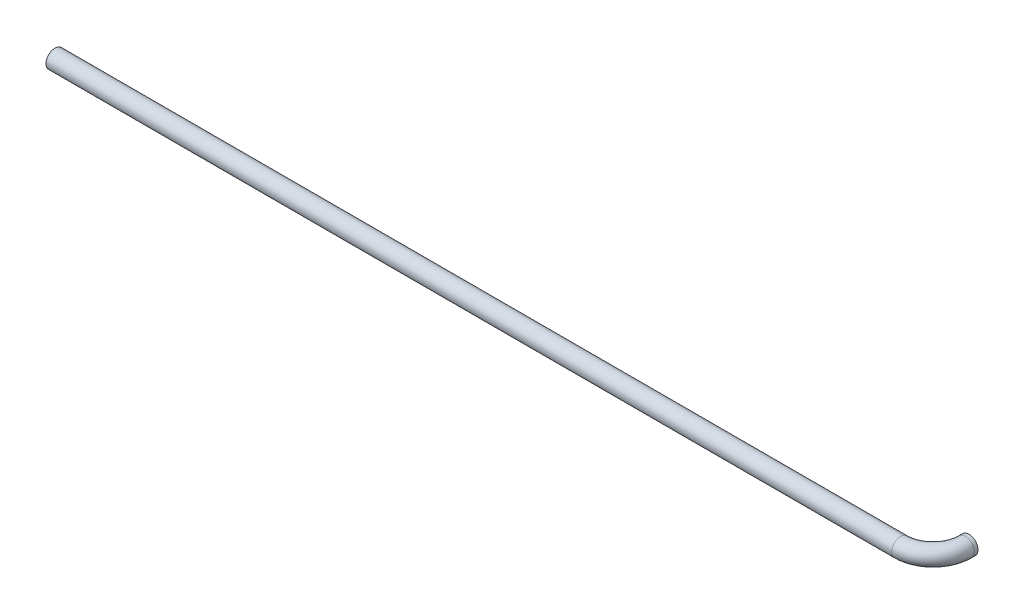
ISO-10303-21;
HEADER;
FILE_DESCRIPTION(('STEP AP214'),'2;1');
FILE_NAME('part.step','',(''),(''),'','','');
FILE_SCHEMA(('AUTOMOTIVE_DESIGN { 1 0 10303 214 1 1 1 1 }'));
ENDSEC;
DATA;
#1=APPLICATION_CONTEXT('core data for automotive mechanical design processes');
#2=APPLICATION_PROTOCOL_DEFINITION('international standard','automotive_design',2000,#1);
#3=PRODUCT_CONTEXT('',#1,'mechanical');
#4=PRODUCT('Part','Part','',(#3));
#5=PRODUCT_RELATED_PRODUCT_CATEGORY('part','',(#4));
#6=PRODUCT_DEFINITION_FORMATION('','',#4);
#7=PRODUCT_DEFINITION_CONTEXT('part definition',#1,'design');
#8=PRODUCT_DEFINITION('design','',#6,#7);
#9=PRODUCT_DEFINITION_SHAPE('','',#8);
#10=(LENGTH_UNIT() NAMED_UNIT(*) SI_UNIT(.MILLI.,.METRE.));
#11=(NAMED_UNIT(*) PLANE_ANGLE_UNIT() SI_UNIT($,.RADIAN.));
#12=(NAMED_UNIT(*) SI_UNIT($,.STERADIAN.) SOLID_ANGLE_UNIT());
#13=UNCERTAINTY_MEASURE_WITH_UNIT(LENGTH_MEASURE(1.E-05),#10,'distance_accuracy_value','');
#14=(GEOMETRIC_REPRESENTATION_CONTEXT(3) GLOBAL_UNCERTAINTY_ASSIGNED_CONTEXT((#13)) GLOBAL_UNIT_ASSIGNED_CONTEXT((#10,
#11,#12)) REPRESENTATION_CONTEXT('',''));
#15=CARTESIAN_POINT('',(0.,0.,0.));
#16=DIRECTION('',(0.,0.,1.));
#17=DIRECTION('',(1.,0.,0.));
#18=AXIS2_PLACEMENT_3D('',#15,#16,#17);
#19=CARTESIAN_POINT('',(-58.5,0.,0.));
#20=DIRECTION('',(1.,0.,0.));
#21=DIRECTION('',(0.,0.,-1.));
#22=AXIS2_PLACEMENT_3D('',#19,#20,#21);
#23=PLANE('',#22);
#24=CARTESIAN_POINT('',(-58.5,0.,0.));
#25=DIRECTION('',(1.,0.,0.));
#26=DIRECTION('',(0.,0.,-1.));
#27=AXIS2_PLACEMENT_3D('',#24,#25,#26);
#28=CIRCLE('',#27,1.25);
#29=CARTESIAN_POINT('',(-58.5,0.,-1.25));
#30=VERTEX_POINT('',#29);
#31=EDGE_CURVE('E10',#30,#30,#28,.T.);
#32=ORIENTED_EDGE('',*,*,#31,.F.);
#33=EDGE_LOOP('',(#32));
#34=FACE_BOUND('',#33,.T.);
#35=CARTESIAN_POINT('',(-58.5,0.,0.));
#36=DIRECTION('',(1.,0.,0.));
#37=DIRECTION('',(0.,0.,-1.));
#38=AXIS2_PLACEMENT_3D('',#35,#36,#37);
#39=CIRCLE('',#38,1.);
#40=CARTESIAN_POINT('',(-58.5,0.,-1.));
#41=VERTEX_POINT('',#40);
#42=EDGE_CURVE('E38',#41,#41,#39,.T.);
#43=ORIENTED_EDGE('',*,*,#42,.T.);
#44=EDGE_LOOP('',(#43));
#45=FACE_BOUND('',#44,.T.);
#46=ADVANCED_FACE('F31',(#34,#45),#23,.F.);
#47=CARTESIAN_POINT('',(58.5,0.,0.));
#48=DIRECTION('',(-1.,0.,0.));
#49=DIRECTION('',(0.,0.,1.));
#50=AXIS2_PLACEMENT_3D('',#47,#48,#49);
#51=CYLINDRICAL_SURFACE('',#50,1.25);
#52=ORIENTED_EDGE('',*,*,#31,.T.);
#53=EDGE_LOOP('',(#52));
#54=FACE_BOUND('',#53,.T.);
#55=CARTESIAN_POINT('',(59.,0.,0.));
#56=DIRECTION('',(1.,0.,0.));
#57=DIRECTION('',(0.,0.,-1.));
#58=AXIS2_PLACEMENT_3D('',#55,#56,#57);
#59=CIRCLE('',#58,1.25);
#60=CARTESIAN_POINT('',(59.,0.,1.25));
#61=VERTEX_POINT('',#60);
#62=EDGE_CURVE('E57',#61,#61,#59,.T.);
#63=ORIENTED_EDGE('',*,*,#62,.F.);
#64=EDGE_LOOP('',(#63));
#65=FACE_BOUND('',#64,.T.);
#66=ADVANCED_FACE('F33',(#54,#65),#51,.T.);
#67=CARTESIAN_POINT('',(58.5,0.,0.));
#68=DIRECTION('',(-1.,0.,0.));
#69=DIRECTION('',(0.,0.,1.));
#70=AXIS2_PLACEMENT_3D('',#67,#68,#69);
#71=CYLINDRICAL_SURFACE('',#70,1.);
#72=ORIENTED_EDGE('',*,*,#42,.F.);
#73=EDGE_LOOP('',(#72));
#74=FACE_BOUND('',#73,.T.);
#75=CARTESIAN_POINT('',(59.,0.,0.));
#76=DIRECTION('',(1.,0.,0.));
#77=DIRECTION('',(0.,0.,-1.));
#78=AXIS2_PLACEMENT_3D('',#75,#76,#77);
#79=CIRCLE('',#78,1.);
#80=CARTESIAN_POINT('',(59.,0.,1.));
#81=VERTEX_POINT('',#80);
#82=EDGE_CURVE('E60',#81,#81,#79,.T.);
#83=ORIENTED_EDGE('',*,*,#82,.T.);
#84=EDGE_LOOP('',(#83));
#85=FACE_BOUND('',#84,.T.);
#86=ADVANCED_FACE('F64',(#74,#85),#71,.F.);
#87=CARTESIAN_POINT('',(63.5,0.,-4.50000000000003));
#88=DIRECTION('',(0.,0.,-1.));
#89=DIRECTION('',(-1.,0.,0.));
#90=AXIS2_PLACEMENT_3D('',#87,#88,#89);
#91=CYLINDRICAL_SURFACE('',#90,1.25);
#92=CARTESIAN_POINT('',(63.5,0.,-4.50000000000003));
#93=DIRECTION('',(0.,0.,-1.));
#94=DIRECTION('',(-1.,0.,0.));
#95=AXIS2_PLACEMENT_3D('',#92,#93,#94);
#96=CIRCLE('',#95,1.25);
#97=CARTESIAN_POINT('',(64.75,0.,-4.50000000000004));
#98=VERTEX_POINT('',#97);
#99=EDGE_CURVE('E51',#98,#98,#96,.T.);
#100=ORIENTED_EDGE('',*,*,#99,.T.);
#101=EDGE_LOOP('',(#100));
#102=FACE_BOUND('',#101,.T.);
#103=CARTESIAN_POINT('',(63.5,0.,-5.));
#104=DIRECTION('',(0.,0.,-1.));
#105=DIRECTION('',(-1.,0.,0.));
#106=AXIS2_PLACEMENT_3D('',#103,#104,#105);
#107=CIRCLE('',#106,1.25);
#108=CARTESIAN_POINT('',(62.25,0.,-4.99999999999998));
#109=VERTEX_POINT('',#108);
#110=EDGE_CURVE('E42',#109,#109,#107,.T.);
#111=ORIENTED_EDGE('',*,*,#110,.F.);
#112=EDGE_LOOP('',(#111));
#113=FACE_BOUND('',#112,.T.);
#114=ADVANCED_FACE('F77',(#102,#113),#91,.T.);
#115=CARTESIAN_POINT('',(63.5,0.,-4.50000000000003));
#116=DIRECTION('',(0.,0.,-1.));
#117=DIRECTION('',(-1.,0.,0.));
#118=AXIS2_PLACEMENT_3D('',#115,#116,#117);
#119=CYLINDRICAL_SURFACE('',#118,1.);
#120=CARTESIAN_POINT('',(63.5,0.,-4.50000000000003));
#121=DIRECTION('',(0.,0.,-1.));
#122=DIRECTION('',(-1.,0.,0.));
#123=AXIS2_PLACEMENT_3D('',#120,#121,#122);
#124=CIRCLE('',#123,1.);
#125=CARTESIAN_POINT('',(64.5,0.,-4.50000000000004));
#126=VERTEX_POINT('',#125);
#127=EDGE_CURVE('E54',#126,#126,#124,.T.);
#128=ORIENTED_EDGE('',*,*,#127,.F.);
#129=EDGE_LOOP('',(#128));
#130=FACE_BOUND('',#129,.T.);
#131=CARTESIAN_POINT('',(63.5,0.,-5.));
#132=DIRECTION('',(0.,0.,-1.));
#133=DIRECTION('',(-1.,0.,0.));
#134=AXIS2_PLACEMENT_3D('',#131,#132,#133);
#135=CIRCLE('',#134,1.);
#136=CARTESIAN_POINT('',(62.5,0.,-4.99999999999999));
#137=VERTEX_POINT('',#136);
#138=EDGE_CURVE('E46',#137,#137,#135,.T.);
#139=ORIENTED_EDGE('',*,*,#138,.T.);
#140=EDGE_LOOP('',(#139));
#141=FACE_BOUND('',#140,.T.);
#142=ADVANCED_FACE('F74',(#130,#141),#119,.F.);
#143=CARTESIAN_POINT('',(59.,0.,-4.5));
#144=DIRECTION('',(0.,1.,0.));
#145=DIRECTION('',(0.,0.,1.));
#146=AXIS2_PLACEMENT_3D('',#143,#144,#145);
#147=TOROIDAL_SURFACE('',#146,4.5,1.25);
#148=CARTESIAN_POINT('',(59.,0.,-4.5));
#149=DIRECTION('',(0.,1.,0.));
#150=DIRECTION('',(0.,0.,1.));
#151=AXIS2_PLACEMENT_3D('',#148,#149,#150);
#152=CIRCLE('',#151,5.75);
#153=EDGE_CURVE('',#61,#98,#152,.T.);
#154=ORIENTED_EDGE('',*,*,#62,.T.);
#155=ORIENTED_EDGE('',*,*,#99,.F.);
#156=ORIENTED_EDGE('',*,*,#153,.T.);
#157=ORIENTED_EDGE('',*,*,#153,.F.);
#158=EDGE_LOOP('',(#154,#156,#155,#157));
#159=FACE_BOUND('',#158,.T.);
#160=ADVANCED_FACE('F70',(#159),#147,.T.);
#161=CARTESIAN_POINT('',(59.,0.,-4.5));
#162=DIRECTION('',(0.,1.,0.));
#163=DIRECTION('',(0.,0.,1.));
#164=AXIS2_PLACEMENT_3D('',#161,#162,#163);
#165=TOROIDAL_SURFACE('',#164,4.5,1.);
#166=CARTESIAN_POINT('',(59.,0.,-4.5));
#167=DIRECTION('',(0.,1.,0.));
#168=DIRECTION('',(0.,0.,1.));
#169=AXIS2_PLACEMENT_3D('',#166,#167,#168);
#170=CIRCLE('',#169,5.5);
#171=EDGE_CURVE('',#81,#126,#170,.T.);
#172=ORIENTED_EDGE('',*,*,#82,.F.);
#173=ORIENTED_EDGE('',*,*,#127,.T.);
#174=ORIENTED_EDGE('',*,*,#171,.T.);
#175=ORIENTED_EDGE('',*,*,#171,.F.);
#176=EDGE_LOOP('',(#172,#174,#173,#175));
#177=FACE_BOUND('',#176,.T.);
#178=ADVANCED_FACE('F66',(#177),#165,.F.);
#179=CARTESIAN_POINT('',(63.5,0.,-5.));
#180=DIRECTION('',(0.,0.,-1.));
#181=DIRECTION('',(-1.,0.,0.));
#182=AXIS2_PLACEMENT_3D('',#179,#180,#181);
#183=PLANE('',#182);
#184=ORIENTED_EDGE('',*,*,#138,.F.);
#185=EDGE_LOOP('',(#184));
#186=FACE_BOUND('',#185,.T.);
#187=ORIENTED_EDGE('',*,*,#110,.T.);
#188=EDGE_LOOP('',(#187));
#189=FACE_BOUND('',#188,.T.);
#190=ADVANCED_FACE('F69',(#186,#189),#183,.T.);
#191=CLOSED_SHELL('',(#46,#66,#86,#114,#142,#160,#178,#190));
#192=MANIFOLD_SOLID_BREP('B2',#191);
#193=ADVANCED_BREP_SHAPE_REPRESENTATION('',(#18,#192),#14);
#194=SHAPE_DEFINITION_REPRESENTATION(#9,#193);
ENDSEC;
END-ISO-10303-21;
